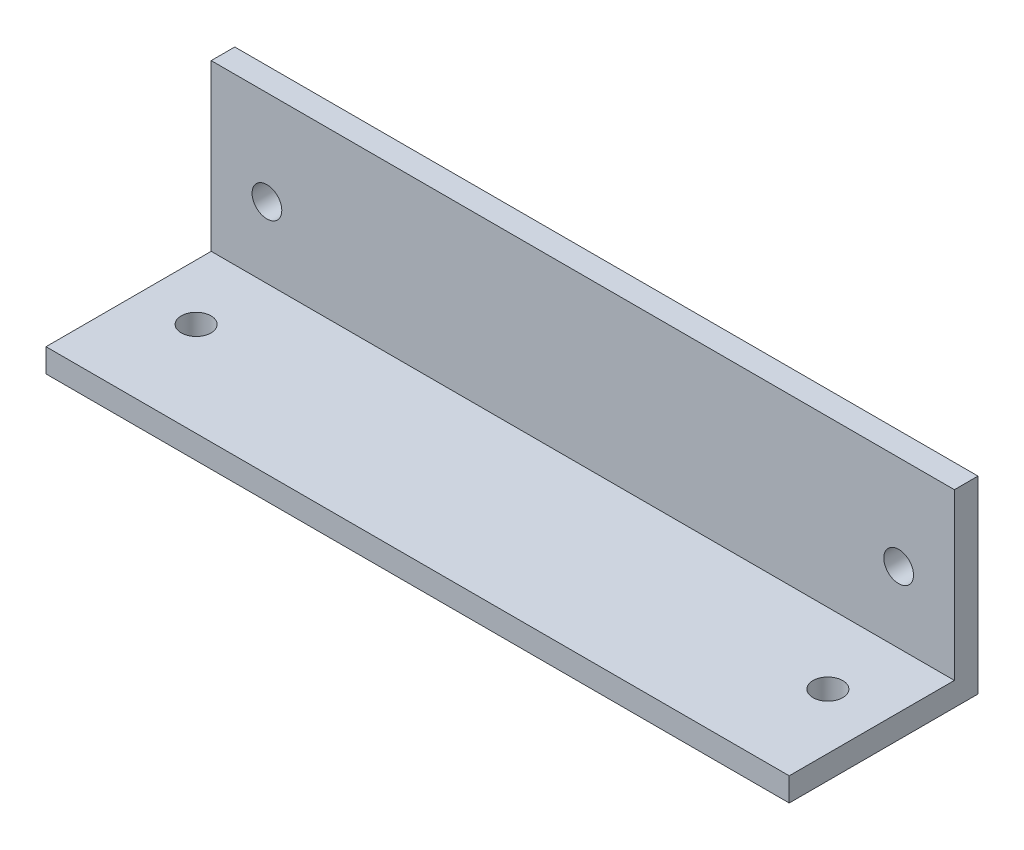
ISO-10303-21;
HEADER;
FILE_DESCRIPTION(('STEP AP214'),'2;1');
FILE_NAME('part.step','',(''),(''),'','','');
FILE_SCHEMA(('AUTOMOTIVE_DESIGN { 1 0 10303 214 1 1 1 1 }'));
ENDSEC;
DATA;
#1=APPLICATION_CONTEXT('core data for automotive mechanical design processes');
#2=APPLICATION_PROTOCOL_DEFINITION('international standard','automotive_design',2000,#1);
#3=PRODUCT_CONTEXT('',#1,'mechanical');
#4=PRODUCT('Part','Part','',(#3));
#5=PRODUCT_RELATED_PRODUCT_CATEGORY('part','',(#4));
#6=PRODUCT_DEFINITION_FORMATION('','',#4);
#7=PRODUCT_DEFINITION_CONTEXT('part definition',#1,'design');
#8=PRODUCT_DEFINITION('design','',#6,#7);
#9=PRODUCT_DEFINITION_SHAPE('','',#8);
#10=(LENGTH_UNIT() NAMED_UNIT(*) SI_UNIT(.MILLI.,.METRE.));
#11=(NAMED_UNIT(*) PLANE_ANGLE_UNIT() SI_UNIT($,.RADIAN.));
#12=(NAMED_UNIT(*) SI_UNIT($,.STERADIAN.) SOLID_ANGLE_UNIT());
#13=UNCERTAINTY_MEASURE_WITH_UNIT(LENGTH_MEASURE(1.E-05),#10,'distance_accuracy_value','');
#14=(GEOMETRIC_REPRESENTATION_CONTEXT(3) GLOBAL_UNCERTAINTY_ASSIGNED_CONTEXT((#13)) GLOBAL_UNIT_ASSIGNED_CONTEXT((#10,
#11,#12)) REPRESENTATION_CONTEXT('',''));
#15=CARTESIAN_POINT('',(0.,0.,0.));
#16=DIRECTION('',(0.,0.,1.));
#17=DIRECTION('',(1.,0.,0.));
#18=AXIS2_PLACEMENT_3D('',#15,#16,#17);
#19=CARTESIAN_POINT('',(100.,6.34999999999999,6.35));
#20=DIRECTION('',(0.,0.,-1.));
#21=DIRECTION('',(0.,1.,0.));
#22=AXIS2_PLACEMENT_3D('',#19,#20,#21);
#23=PLANE('',#22);
#24=CARTESIAN_POINT('',(-85.,25.4,6.35));
#25=DIRECTION('',(0.,0.,-1.));
#26=DIRECTION('',(0.,1.,0.));
#27=AXIS2_PLACEMENT_3D('',#24,#25,#26);
#28=CIRCLE('',#27,3.99999999999999);
#29=CARTESIAN_POINT('',(-85.,29.4,6.35));
#30=VERTEX_POINT('',#29);
#31=EDGE_CURVE('E150',#30,#30,#28,.T.);
#32=ORIENTED_EDGE('',*,*,#31,.T.);
#33=EDGE_LOOP('',(#32));
#34=FACE_BOUND('',#33,.T.);
#35=DIRECTION('',(0.,-1.,0.));
#36=VECTOR('',#35,1.);
#37=CARTESIAN_POINT('',(-100.,6.34999999999999,6.35));
#38=LINE('',#37,#36);
#39=CARTESIAN_POINT('',(-100.,50.8,6.35));
#40=VERTEX_POINT('',#39);
#41=CARTESIAN_POINT('',(-100.,6.34999999999999,6.35));
#42=VERTEX_POINT('',#41);
#43=EDGE_CURVE('E120',#40,#42,#38,.T.);
#44=ORIENTED_EDGE('',*,*,#43,.T.);
#45=DIRECTION('',(-1.,0.,0.));
#46=VECTOR('',#45,1.);
#47=CARTESIAN_POINT('',(100.,6.34999999999999,6.35));
#48=LINE('',#47,#46);
#49=CARTESIAN_POINT('',(100.,6.34999999999999,6.35));
#50=VERTEX_POINT('',#49);
#51=EDGE_CURVE('E41',#50,#42,#48,.T.);
#52=ORIENTED_EDGE('',*,*,#51,.F.);
#53=DIRECTION('',(0.,-1.,0.));
#54=VECTOR('',#53,1.);
#55=CARTESIAN_POINT('',(100.,6.34999999999999,6.35));
#56=LINE('',#55,#54);
#57=CARTESIAN_POINT('',(100.,50.8,6.35));
#58=VERTEX_POINT('',#57);
#59=EDGE_CURVE('E86',#58,#50,#56,.T.);
#60=ORIENTED_EDGE('',*,*,#59,.F.);
#61=DIRECTION('',(-1.,0.,0.));
#62=VECTOR('',#61,1.);
#63=CARTESIAN_POINT('',(100.,50.8,6.35));
#64=LINE('',#63,#62);
#65=EDGE_CURVE('E11',#58,#40,#64,.T.);
#66=ORIENTED_EDGE('',*,*,#65,.T.);
#67=EDGE_LOOP('',(#44,#52,#60,#66));
#68=FACE_BOUND('',#67,.T.);
#69=CARTESIAN_POINT('',(85.,25.4,6.35));
#70=DIRECTION('',(0.,0.,-1.));
#71=DIRECTION('',(0.,1.,0.));
#72=AXIS2_PLACEMENT_3D('',#69,#70,#71);
#73=CIRCLE('',#72,3.99999999999999);
#74=CARTESIAN_POINT('',(85.,29.4,6.35));
#75=VERTEX_POINT('',#74);
#76=EDGE_CURVE('E151',#75,#75,#73,.T.);
#77=ORIENTED_EDGE('',*,*,#76,.T.);
#78=EDGE_LOOP('',(#77));
#79=FACE_BOUND('',#78,.T.);
#80=ADVANCED_FACE('F32',(#34,#68,#79),#23,.F.);
#81=CARTESIAN_POINT('',(100.,50.8,0.));
#82=DIRECTION('',(0.,0.,1.));
#83=DIRECTION('',(1.,0.,0.));
#84=AXIS2_PLACEMENT_3D('',#81,#82,#83);
#85=PLANE('',#84);
#86=CARTESIAN_POINT('',(-85.,25.4,0.));
#87=DIRECTION('',(0.,0.,1.));
#88=DIRECTION('',(0.,-1.,0.));
#89=AXIS2_PLACEMENT_3D('',#86,#87,#88);
#90=CIRCLE('',#89,3.99999999999999);
#91=CARTESIAN_POINT('',(-85.,21.4,0.));
#92=VERTEX_POINT('',#91);
#93=EDGE_CURVE('E154',#92,#92,#90,.T.);
#94=ORIENTED_EDGE('',*,*,#93,.T.);
#95=EDGE_LOOP('',(#94));
#96=FACE_BOUND('',#95,.T.);
#97=DIRECTION('',(0.,1.,0.));
#98=VECTOR('',#97,1.);
#99=CARTESIAN_POINT('',(-100.,50.8,0.));
#100=LINE('',#99,#98);
#101=CARTESIAN_POINT('',(-100.,0.,0.));
#102=VERTEX_POINT('',#101);
#103=CARTESIAN_POINT('',(-100.,50.8,0.));
#104=VERTEX_POINT('',#103);
#105=EDGE_CURVE('E78',#102,#104,#100,.T.);
#106=ORIENTED_EDGE('',*,*,#105,.T.);
#107=DIRECTION('',(-1.,0.,0.));
#108=VECTOR('',#107,1.);
#109=CARTESIAN_POINT('',(100.,50.8,0.));
#110=LINE('',#109,#108);
#111=CARTESIAN_POINT('',(100.,50.8,0.));
#112=VERTEX_POINT('',#111);
#113=EDGE_CURVE('E113',#112,#104,#110,.T.);
#114=ORIENTED_EDGE('',*,*,#113,.F.);
#115=DIRECTION('',(0.,1.,0.));
#116=VECTOR('',#115,1.);
#117=CARTESIAN_POINT('',(100.,50.8,0.));
#118=LINE('',#117,#116);
#119=CARTESIAN_POINT('',(100.,0.,0.));
#120=VERTEX_POINT('',#119);
#121=EDGE_CURVE('E49',#120,#112,#118,.T.);
#122=ORIENTED_EDGE('',*,*,#121,.F.);
#123=DIRECTION('',(-1.,0.,0.));
#124=VECTOR('',#123,1.);
#125=CARTESIAN_POINT('',(100.,0.,0.));
#126=LINE('',#125,#124);
#127=EDGE_CURVE('E109',#120,#102,#126,.T.);
#128=ORIENTED_EDGE('',*,*,#127,.T.);
#129=EDGE_LOOP('',(#106,#114,#122,#128));
#130=FACE_BOUND('',#129,.T.);
#131=CARTESIAN_POINT('',(85.,25.4,0.));
#132=DIRECTION('',(0.,0.,1.));
#133=DIRECTION('',(0.,1.,0.));
#134=AXIS2_PLACEMENT_3D('',#131,#132,#133);
#135=CIRCLE('',#134,3.99999999999999);
#136=CARTESIAN_POINT('',(85.,29.4,0.));
#137=VERTEX_POINT('',#136);
#138=EDGE_CURVE('E148',#137,#137,#135,.T.);
#139=ORIENTED_EDGE('',*,*,#138,.T.);
#140=EDGE_LOOP('',(#139));
#141=FACE_BOUND('',#140,.T.);
#142=ADVANCED_FACE('F141',(#96,#130,#141),#85,.F.);
#143=CARTESIAN_POINT('',(100.,50.8,6.35));
#144=DIRECTION('',(0.,-1.,0.));
#145=DIRECTION('',(0.,0.,-1.));
#146=AXIS2_PLACEMENT_3D('',#143,#144,#145);
#147=PLANE('',#146);
#148=DIRECTION('',(0.,0.,1.));
#149=VECTOR('',#148,1.);
#150=CARTESIAN_POINT('',(-100.,50.8,6.35));
#151=LINE('',#150,#149);
#152=EDGE_CURVE('E117',#104,#40,#151,.T.);
#153=ORIENTED_EDGE('',*,*,#152,.T.);
#154=ORIENTED_EDGE('',*,*,#65,.F.);
#155=DIRECTION('',(0.,0.,1.));
#156=VECTOR('',#155,1.);
#157=CARTESIAN_POINT('',(100.,50.8,6.35));
#158=LINE('',#157,#156);
#159=EDGE_CURVE('E128',#112,#58,#158,.T.);
#160=ORIENTED_EDGE('',*,*,#159,.F.);
#161=ORIENTED_EDGE('',*,*,#113,.T.);
#162=EDGE_LOOP('',(#153,#154,#160,#161));
#163=FACE_BOUND('',#162,.T.);
#164=ADVANCED_FACE('F34',(#163),#147,.F.);
#165=CARTESIAN_POINT('',(100.,6.34999999999999,50.8));
#166=DIRECTION('',(0.,-1.,0.));
#167=DIRECTION('',(0.,0.,-1.));
#168=AXIS2_PLACEMENT_3D('',#165,#166,#167);
#169=PLANE('',#168);
#170=CARTESIAN_POINT('',(85.,6.34999999999999,25.4));
#171=DIRECTION('',(0.,-1.,0.));
#172=DIRECTION('',(0.,0.,-1.));
#173=AXIS2_PLACEMENT_3D('',#170,#171,#172);
#174=CIRCLE('',#173,3.99999999999999);
#175=CARTESIAN_POINT('',(85.,6.34999999999999,21.4));
#176=VERTEX_POINT('',#175);
#177=EDGE_CURVE('E164',#176,#176,#174,.F.);
#178=ORIENTED_EDGE('',*,*,#177,.F.);
#179=EDGE_LOOP('',(#178));
#180=FACE_BOUND('',#179,.T.);
#181=CARTESIAN_POINT('',(-85.,6.34999999999999,25.4));
#182=DIRECTION('',(0.,-1.,0.));
#183=DIRECTION('',(0.,0.,-1.));
#184=AXIS2_PLACEMENT_3D('',#181,#182,#183);
#185=CIRCLE('',#184,3.99999999999999);
#186=CARTESIAN_POINT('',(-85.,6.34999999999999,21.4));
#187=VERTEX_POINT('',#186);
#188=EDGE_CURVE('E121',#187,#187,#185,.F.);
#189=ORIENTED_EDGE('',*,*,#188,.F.);
#190=EDGE_LOOP('',(#189));
#191=FACE_BOUND('',#190,.T.);
#192=DIRECTION('',(0.,0.,1.));
#193=VECTOR('',#192,1.);
#194=CARTESIAN_POINT('',(-100.,6.34999999999999,50.8));
#195=LINE('',#194,#193);
#196=CARTESIAN_POINT('',(-100.,6.34999999999999,50.8));
#197=VERTEX_POINT('',#196);
#198=EDGE_CURVE('E123',#42,#197,#195,.T.);
#199=ORIENTED_EDGE('',*,*,#198,.T.);
#200=DIRECTION('',(-1.,0.,0.));
#201=VECTOR('',#200,1.);
#202=CARTESIAN_POINT('',(100.,6.34999999999999,50.8));
#203=LINE('',#202,#201);
#204=CARTESIAN_POINT('',(100.,6.34999999999999,50.8));
#205=VERTEX_POINT('',#204);
#206=EDGE_CURVE('E108',#205,#197,#203,.T.);
#207=ORIENTED_EDGE('',*,*,#206,.F.);
#208=DIRECTION('',(0.,0.,1.));
#209=VECTOR('',#208,1.);
#210=CARTESIAN_POINT('',(100.,6.34999999999999,50.8));
#211=LINE('',#210,#209);
#212=EDGE_CURVE('E99',#50,#205,#211,.T.);
#213=ORIENTED_EDGE('',*,*,#212,.F.);
#214=ORIENTED_EDGE('',*,*,#51,.T.);
#215=EDGE_LOOP('',(#199,#207,#213,#214));
#216=FACE_BOUND('',#215,.T.);
#217=ADVANCED_FACE('F134',(#180,#191,#216),#169,.F.);
#218=CARTESIAN_POINT('',(100.,0.,50.8));
#219=DIRECTION('',(0.,0.,-1.));
#220=DIRECTION('',(-1.,0.,0.));
#221=AXIS2_PLACEMENT_3D('',#218,#219,#220);
#222=PLANE('',#221);
#223=DIRECTION('',(0.,-1.,0.));
#224=VECTOR('',#223,1.);
#225=CARTESIAN_POINT('',(-100.,0.,50.8));
#226=LINE('',#225,#224);
#227=CARTESIAN_POINT('',(-100.,0.,50.8));
#228=VERTEX_POINT('',#227);
#229=EDGE_CURVE('E107',#197,#228,#226,.T.);
#230=ORIENTED_EDGE('',*,*,#229,.T.);
#231=DIRECTION('',(-1.,0.,0.));
#232=VECTOR('',#231,1.);
#233=CARTESIAN_POINT('',(100.,0.,50.8));
#234=LINE('',#233,#232);
#235=CARTESIAN_POINT('',(100.,0.,50.8));
#236=VERTEX_POINT('',#235);
#237=EDGE_CURVE('E104',#236,#228,#234,.T.);
#238=ORIENTED_EDGE('',*,*,#237,.F.);
#239=DIRECTION('',(0.,-1.,0.));
#240=VECTOR('',#239,1.);
#241=CARTESIAN_POINT('',(100.,0.,50.8));
#242=LINE('',#241,#240);
#243=EDGE_CURVE('E93',#205,#236,#242,.T.);
#244=ORIENTED_EDGE('',*,*,#243,.F.);
#245=ORIENTED_EDGE('',*,*,#206,.T.);
#246=EDGE_LOOP('',(#230,#238,#244,#245));
#247=FACE_BOUND('',#246,.T.);
#248=ADVANCED_FACE('F105',(#247),#222,.F.);
#249=CARTESIAN_POINT('',(100.,0.,0.));
#250=DIRECTION('',(0.,1.,0.));
#251=DIRECTION('',(0.,0.,1.));
#252=AXIS2_PLACEMENT_3D('',#249,#250,#251);
#253=PLANE('',#252);
#254=CARTESIAN_POINT('',(85.,0.,25.4));
#255=DIRECTION('',(0.,-1.,0.));
#256=DIRECTION('',(0.,0.,1.));
#257=AXIS2_PLACEMENT_3D('',#254,#255,#256);
#258=CIRCLE('',#257,3.99999999999999);
#259=CARTESIAN_POINT('',(85.,0.,29.4));
#260=VERTEX_POINT('',#259);
#261=EDGE_CURVE('E160',#260,#260,#258,.T.);
#262=ORIENTED_EDGE('',*,*,#261,.F.);
#263=EDGE_LOOP('',(#262));
#264=FACE_BOUND('',#263,.T.);
#265=CARTESIAN_POINT('',(-85.,0.,25.4));
#266=DIRECTION('',(0.,-1.,0.));
#267=DIRECTION('',(0.,0.,-1.));
#268=AXIS2_PLACEMENT_3D('',#265,#266,#267);
#269=CIRCLE('',#268,3.99999999999999);
#270=CARTESIAN_POINT('',(-85.,0.,21.4));
#271=VERTEX_POINT('',#270);
#272=EDGE_CURVE('E167',#271,#271,#269,.T.);
#273=ORIENTED_EDGE('',*,*,#272,.F.);
#274=EDGE_LOOP('',(#273));
#275=FACE_BOUND('',#274,.T.);
#276=DIRECTION('',(0.,0.,-1.));
#277=VECTOR('',#276,1.);
#278=CARTESIAN_POINT('',(-100.,0.,0.));
#279=LINE('',#278,#277);
#280=EDGE_CURVE('E72',#228,#102,#279,.T.);
#281=ORIENTED_EDGE('',*,*,#280,.T.);
#282=ORIENTED_EDGE('',*,*,#127,.F.);
#283=DIRECTION('',(0.,0.,-1.));
#284=VECTOR('',#283,1.);
#285=CARTESIAN_POINT('',(100.,0.,0.));
#286=LINE('',#285,#284);
#287=EDGE_CURVE('E97',#236,#120,#286,.T.);
#288=ORIENTED_EDGE('',*,*,#287,.F.);
#289=ORIENTED_EDGE('',*,*,#237,.T.);
#290=EDGE_LOOP('',(#281,#282,#288,#289));
#291=FACE_BOUND('',#290,.T.);
#292=ADVANCED_FACE('F111',(#264,#275,#291),#253,.F.);
#293=CARTESIAN_POINT('',(100.,0.,0.));
#294=DIRECTION('',(-1.,0.,0.));
#295=DIRECTION('',(0.,0.,1.));
#296=AXIS2_PLACEMENT_3D('',#293,#294,#295);
#297=PLANE('',#296);
#298=ORIENTED_EDGE('',*,*,#159,.T.);
#299=ORIENTED_EDGE('',*,*,#59,.T.);
#300=ORIENTED_EDGE('',*,*,#212,.T.);
#301=ORIENTED_EDGE('',*,*,#243,.T.);
#302=ORIENTED_EDGE('',*,*,#287,.T.);
#303=ORIENTED_EDGE('',*,*,#121,.T.);
#304=EDGE_LOOP('',(#298,#299,#300,#301,#302,#303));
#305=FACE_BOUND('',#304,.T.);
#306=ADVANCED_FACE('F95',(#305),#297,.F.);
#307=CARTESIAN_POINT('',(-100.,0.,0.));
#308=DIRECTION('',(-1.,0.,0.));
#309=DIRECTION('',(0.,0.,1.));
#310=AXIS2_PLACEMENT_3D('',#307,#308,#309);
#311=PLANE('',#310);
#312=ORIENTED_EDGE('',*,*,#152,.F.);
#313=ORIENTED_EDGE('',*,*,#105,.F.);
#314=ORIENTED_EDGE('',*,*,#280,.F.);
#315=ORIENTED_EDGE('',*,*,#229,.F.);
#316=ORIENTED_EDGE('',*,*,#198,.F.);
#317=ORIENTED_EDGE('',*,*,#43,.F.);
#318=EDGE_LOOP('',(#312,#313,#314,#315,#316,#317));
#319=FACE_BOUND('',#318,.T.);
#320=ADVANCED_FACE('F137',(#319),#311,.T.);
#321=CARTESIAN_POINT('',(-85.,50.801,25.4));
#322=DIRECTION('',(0.,-1.,0.));
#323=DIRECTION('',(0.,0.,-1.));
#324=AXIS2_PLACEMENT_3D('',#321,#322,#323);
#325=CYLINDRICAL_SURFACE('',#324,3.99999999999999);
#326=ORIENTED_EDGE('',*,*,#272,.T.);
#327=EDGE_LOOP('',(#326));
#328=FACE_BOUND('',#327,.T.);
#329=ORIENTED_EDGE('',*,*,#188,.T.);
#330=EDGE_LOOP('',(#329));
#331=FACE_BOUND('',#330,.T.);
#332=ADVANCED_FACE('F175',(#328,#331),#325,.F.);
#333=CARTESIAN_POINT('',(85.,50.801,25.4));
#334=DIRECTION('',(0.,-1.,0.));
#335=DIRECTION('',(0.,0.,-1.));
#336=AXIS2_PLACEMENT_3D('',#333,#334,#335);
#337=CYLINDRICAL_SURFACE('',#336,3.99999999999999);
#338=ORIENTED_EDGE('',*,*,#261,.T.);
#339=EDGE_LOOP('',(#338));
#340=FACE_BOUND('',#339,.T.);
#341=ORIENTED_EDGE('',*,*,#177,.T.);
#342=EDGE_LOOP('',(#341));
#343=FACE_BOUND('',#342,.T.);
#344=ADVANCED_FACE('F201',(#340,#343),#337,.F.);
#345=CARTESIAN_POINT('',(-85.,25.3999999999999,50.801));
#346=DIRECTION('',(0.,0.,-1.));
#347=DIRECTION('',(0.,1.,0.));
#348=AXIS2_PLACEMENT_3D('',#345,#346,#347);
#349=CYLINDRICAL_SURFACE('',#348,3.99999999999999);
#350=ORIENTED_EDGE('',*,*,#93,.F.);
#351=EDGE_LOOP('',(#350));
#352=FACE_BOUND('',#351,.T.);
#353=ORIENTED_EDGE('',*,*,#31,.F.);
#354=EDGE_LOOP('',(#353));
#355=FACE_BOUND('',#354,.T.);
#356=ADVANCED_FACE('F196',(#352,#355),#349,.F.);
#357=CARTESIAN_POINT('',(85.,25.4,50.801));
#358=DIRECTION('',(0.,0.,-1.));
#359=DIRECTION('',(0.,1.,0.));
#360=AXIS2_PLACEMENT_3D('',#357,#358,#359);
#361=CYLINDRICAL_SURFACE('',#360,3.99999999999999);
#362=ORIENTED_EDGE('',*,*,#138,.F.);
#363=EDGE_LOOP('',(#362));
#364=FACE_BOUND('',#363,.T.);
#365=ORIENTED_EDGE('',*,*,#76,.F.);
#366=EDGE_LOOP('',(#365));
#367=FACE_BOUND('',#366,.T.);
#368=ADVANCED_FACE('F194',(#364,#367),#361,.F.);
#369=CLOSED_SHELL('',(#80,#142,#164,#217,#248,#292,#306,#320,#332,#344,#356,#368));
#370=MANIFOLD_SOLID_BREP('B2',#369);
#371=ADVANCED_BREP_SHAPE_REPRESENTATION('',(#18,#370),#14);
#372=SHAPE_DEFINITION_REPRESENTATION(#9,#371);
ENDSEC;
END-ISO-10303-21;
